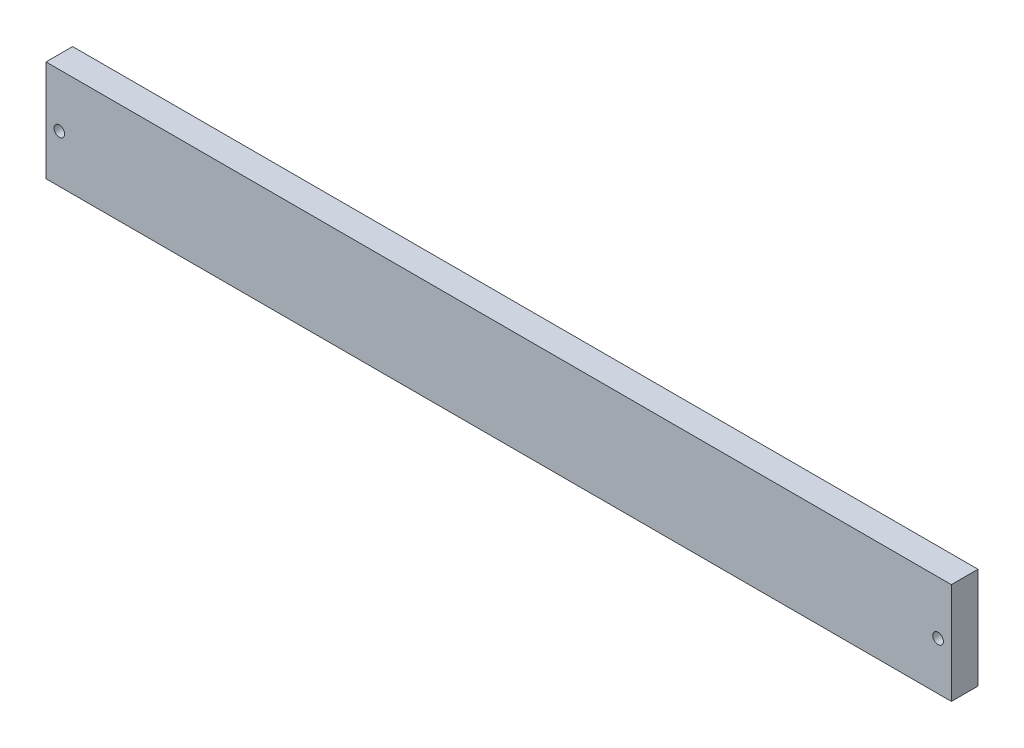
ISO-10303-21;
HEADER;
FILE_DESCRIPTION(('STEP AP214'),'2;1');
FILE_NAME('part.step','',(''),(''),'','','');
FILE_SCHEMA(('AUTOMOTIVE_DESIGN { 1 0 10303 214 1 1 1 1 }'));
ENDSEC;
DATA;
#1=APPLICATION_CONTEXT('core data for automotive mechanical design processes');
#2=APPLICATION_PROTOCOL_DEFINITION('international standard','automotive_design',2000,#1);
#3=PRODUCT_CONTEXT('',#1,'mechanical');
#4=PRODUCT('Part','Part','',(#3));
#5=PRODUCT_RELATED_PRODUCT_CATEGORY('part','',(#4));
#6=PRODUCT_DEFINITION_FORMATION('','',#4);
#7=PRODUCT_DEFINITION_CONTEXT('part definition',#1,'design');
#8=PRODUCT_DEFINITION('design','',#6,#7);
#9=PRODUCT_DEFINITION_SHAPE('','',#8);
#10=(LENGTH_UNIT() NAMED_UNIT(*) SI_UNIT(.MILLI.,.METRE.));
#11=(NAMED_UNIT(*) PLANE_ANGLE_UNIT() SI_UNIT($,.RADIAN.));
#12=(NAMED_UNIT(*) SI_UNIT($,.STERADIAN.) SOLID_ANGLE_UNIT());
#13=UNCERTAINTY_MEASURE_WITH_UNIT(LENGTH_MEASURE(1.E-05),#10,'distance_accuracy_value','');
#14=(GEOMETRIC_REPRESENTATION_CONTEXT(3) GLOBAL_UNCERTAINTY_ASSIGNED_CONTEXT((#13)) GLOBAL_UNIT_ASSIGNED_CONTEXT((#10,
#11,#12)) REPRESENTATION_CONTEXT('',''));
#15=CARTESIAN_POINT('',(0.,0.,0.));
#16=DIRECTION('',(0.,0.,1.));
#17=DIRECTION('',(1.,0.,0.));
#18=AXIS2_PLACEMENT_3D('',#15,#16,#17);
#19=CARTESIAN_POINT('',(0.,0.,10.));
#20=DIRECTION('',(1.,0.,0.));
#21=DIRECTION('',(0.,0.,-1.));
#22=AXIS2_PLACEMENT_3D('',#19,#20,#21);
#23=PLANE('',#22);
#24=DIRECTION('',(0.,-1.,0.));
#25=VECTOR('',#24,1.);
#26=CARTESIAN_POINT('',(0.,0.,0.));
#27=LINE('',#26,#25);
#28=CARTESIAN_POINT('',(0.,38.,0.));
#29=VERTEX_POINT('',#28);
#30=CARTESIAN_POINT('',(0.,0.,0.));
#31=VERTEX_POINT('',#30);
#32=EDGE_CURVE('E96',#29,#31,#27,.T.);
#33=ORIENTED_EDGE('',*,*,#32,.T.);
#34=DIRECTION('',(0.,0.,-1.));
#35=VECTOR('',#34,1.);
#36=CARTESIAN_POINT('',(0.,0.,10.));
#37=LINE('',#36,#35);
#38=CARTESIAN_POINT('',(0.,0.,10.));
#39=VERTEX_POINT('',#38);
#40=EDGE_CURVE('E11',#39,#31,#37,.T.);
#41=ORIENTED_EDGE('',*,*,#40,.F.);
#42=DIRECTION('',(0.,-1.,0.));
#43=VECTOR('',#42,1.);
#44=CARTESIAN_POINT('',(0.,0.,10.));
#45=LINE('',#44,#43);
#46=CARTESIAN_POINT('',(0.,38.,10.));
#47=VERTEX_POINT('',#46);
#48=EDGE_CURVE('E84',#47,#39,#45,.T.);
#49=ORIENTED_EDGE('',*,*,#48,.F.);
#50=DIRECTION('',(0.,0.,-1.));
#51=VECTOR('',#50,1.);
#52=CARTESIAN_POINT('',(0.,38.,10.));
#53=LINE('',#52,#51);
#54=EDGE_CURVE('E92',#47,#29,#53,.T.);
#55=ORIENTED_EDGE('',*,*,#54,.T.);
#56=EDGE_LOOP('',(#33,#41,#49,#55));
#57=FACE_BOUND('',#56,.T.);
#58=ADVANCED_FACE('F33',(#57),#23,.F.);
#59=CARTESIAN_POINT('',(0.,0.,10.));
#60=DIRECTION('',(0.,1.,0.));
#61=DIRECTION('',(0.,0.,1.));
#62=AXIS2_PLACEMENT_3D('',#59,#60,#61);
#63=PLANE('',#62);
#64=DIRECTION('',(1.,0.,0.));
#65=VECTOR('',#64,1.);
#66=CARTESIAN_POINT('',(0.,0.,0.));
#67=LINE('',#66,#65);
#68=CARTESIAN_POINT('',(340.,0.,0.));
#69=VERTEX_POINT('',#68);
#70=EDGE_CURVE('E88',#31,#69,#67,.T.);
#71=ORIENTED_EDGE('',*,*,#70,.T.);
#72=DIRECTION('',(0.,0.,-1.));
#73=VECTOR('',#72,1.);
#74=CARTESIAN_POINT('',(340.,0.,10.));
#75=LINE('',#74,#73);
#76=CARTESIAN_POINT('',(340.,0.,10.));
#77=VERTEX_POINT('',#76);
#78=EDGE_CURVE('E41',#77,#69,#75,.T.);
#79=ORIENTED_EDGE('',*,*,#78,.F.);
#80=DIRECTION('',(1.,0.,0.));
#81=VECTOR('',#80,1.);
#82=CARTESIAN_POINT('',(0.,0.,10.));
#83=LINE('',#82,#81);
#84=EDGE_CURVE('E79',#39,#77,#83,.T.);
#85=ORIENTED_EDGE('',*,*,#84,.F.);
#86=ORIENTED_EDGE('',*,*,#40,.T.);
#87=EDGE_LOOP('',(#71,#79,#85,#86));
#88=FACE_BOUND('',#87,.T.);
#89=ADVANCED_FACE('F87',(#88),#63,.F.);
#90=CARTESIAN_POINT('',(340.,0.,10.));
#91=DIRECTION('',(-1.,0.,0.));
#92=DIRECTION('',(0.,0.,1.));
#93=AXIS2_PLACEMENT_3D('',#90,#91,#92);
#94=PLANE('',#93);
#95=DIRECTION('',(0.,1.,0.));
#96=VECTOR('',#95,1.);
#97=CARTESIAN_POINT('',(340.,0.,0.));
#98=LINE('',#97,#96);
#99=CARTESIAN_POINT('',(340.,38.,0.));
#100=VERTEX_POINT('',#99);
#101=EDGE_CURVE('E66',#69,#100,#98,.T.);
#102=ORIENTED_EDGE('',*,*,#101,.T.);
#103=DIRECTION('',(0.,0.,-1.));
#104=VECTOR('',#103,1.);
#105=CARTESIAN_POINT('',(340.,38.,10.));
#106=LINE('',#105,#104);
#107=CARTESIAN_POINT('',(340.,38.,10.));
#108=VERTEX_POINT('',#107);
#109=EDGE_CURVE('E89',#108,#100,#106,.T.);
#110=ORIENTED_EDGE('',*,*,#109,.F.);
#111=DIRECTION('',(0.,1.,0.));
#112=VECTOR('',#111,1.);
#113=CARTESIAN_POINT('',(340.,0.,10.));
#114=LINE('',#113,#112);
#115=EDGE_CURVE('E82',#77,#108,#114,.T.);
#116=ORIENTED_EDGE('',*,*,#115,.F.);
#117=ORIENTED_EDGE('',*,*,#78,.T.);
#118=EDGE_LOOP('',(#102,#110,#116,#117));
#119=FACE_BOUND('',#118,.T.);
#120=ADVANCED_FACE('F90',(#119),#94,.F.);
#121=CARTESIAN_POINT('',(0.,38.,10.));
#122=DIRECTION('',(0.,-1.,0.));
#123=DIRECTION('',(0.,0.,-1.));
#124=AXIS2_PLACEMENT_3D('',#121,#122,#123);
#125=PLANE('',#124);
#126=DIRECTION('',(-1.,0.,0.));
#127=VECTOR('',#126,1.);
#128=CARTESIAN_POINT('',(0.,38.,0.));
#129=LINE('',#128,#127);
#130=EDGE_CURVE('E72',#100,#29,#129,.T.);
#131=ORIENTED_EDGE('',*,*,#130,.T.);
#132=ORIENTED_EDGE('',*,*,#54,.F.);
#133=DIRECTION('',(-1.,0.,0.));
#134=VECTOR('',#133,1.);
#135=CARTESIAN_POINT('',(0.,38.,10.));
#136=LINE('',#135,#134);
#137=EDGE_CURVE('E49',#108,#47,#136,.T.);
#138=ORIENTED_EDGE('',*,*,#137,.F.);
#139=ORIENTED_EDGE('',*,*,#109,.T.);
#140=EDGE_LOOP('',(#131,#132,#138,#139));
#141=FACE_BOUND('',#140,.T.);
#142=ADVANCED_FACE('F104',(#141),#125,.F.);
#143=CARTESIAN_POINT('',(0.,0.,10.));
#144=DIRECTION('',(0.,0.,-1.));
#145=DIRECTION('',(-1.,0.,0.));
#146=AXIS2_PLACEMENT_3D('',#143,#144,#145);
#147=PLANE('',#146);
#148=CARTESIAN_POINT('',(5.,18.,10.));
#149=DIRECTION('',(0.,0.,-1.));
#150=DIRECTION('',(-1.,0.,0.));
#151=AXIS2_PLACEMENT_3D('',#148,#149,#150);
#152=CIRCLE('',#151,2.);
#153=CARTESIAN_POINT('',(3.,18.,10.));
#154=VERTEX_POINT('',#153);
#155=EDGE_CURVE('E99',#154,#154,#152,.T.);
#156=ORIENTED_EDGE('',*,*,#155,.T.);
#157=EDGE_LOOP('',(#156));
#158=FACE_BOUND('',#157,.T.);
#159=CARTESIAN_POINT('',(335.,18.,10.));
#160=DIRECTION('',(0.,0.,-1.));
#161=DIRECTION('',(-1.,0.,0.));
#162=AXIS2_PLACEMENT_3D('',#159,#160,#161);
#163=CIRCLE('',#162,2.);
#164=CARTESIAN_POINT('',(333.,18.,10.));
#165=VERTEX_POINT('',#164);
#166=EDGE_CURVE('E112',#165,#165,#163,.T.);
#167=ORIENTED_EDGE('',*,*,#166,.T.);
#168=EDGE_LOOP('',(#167));
#169=FACE_BOUND('',#168,.T.);
#170=ORIENTED_EDGE('',*,*,#48,.T.);
#171=ORIENTED_EDGE('',*,*,#84,.T.);
#172=ORIENTED_EDGE('',*,*,#115,.T.);
#173=ORIENTED_EDGE('',*,*,#137,.T.);
#174=EDGE_LOOP('',(#170,#171,#172,#173));
#175=FACE_BOUND('',#174,.T.);
#176=ADVANCED_FACE('F80',(#158,#169,#175),#147,.F.);
#177=CARTESIAN_POINT('',(0.,0.,0.));
#178=DIRECTION('',(0.,0.,-1.));
#179=DIRECTION('',(-1.,0.,0.));
#180=AXIS2_PLACEMENT_3D('',#177,#178,#179);
#181=PLANE('',#180);
#182=CARTESIAN_POINT('',(5.,18.,0.));
#183=DIRECTION('',(0.,0.,1.));
#184=DIRECTION('',(1.,0.,0.));
#185=AXIS2_PLACEMENT_3D('',#182,#183,#184);
#186=CIRCLE('',#185,2.);
#187=CARTESIAN_POINT('',(7.00000000000001,18.,0.));
#188=VERTEX_POINT('',#187);
#189=EDGE_CURVE('E115',#188,#188,#186,.T.);
#190=ORIENTED_EDGE('',*,*,#189,.T.);
#191=EDGE_LOOP('',(#190));
#192=FACE_BOUND('',#191,.T.);
#193=CARTESIAN_POINT('',(335.,18.,0.));
#194=DIRECTION('',(0.,0.,1.));
#195=DIRECTION('',(-1.,0.,0.));
#196=AXIS2_PLACEMENT_3D('',#193,#194,#195);
#197=CIRCLE('',#196,2.);
#198=CARTESIAN_POINT('',(333.,18.,0.));
#199=VERTEX_POINT('',#198);
#200=EDGE_CURVE('E116',#199,#199,#197,.T.);
#201=ORIENTED_EDGE('',*,*,#200,.T.);
#202=EDGE_LOOP('',(#201));
#203=FACE_BOUND('',#202,.T.);
#204=ORIENTED_EDGE('',*,*,#32,.F.);
#205=ORIENTED_EDGE('',*,*,#130,.F.);
#206=ORIENTED_EDGE('',*,*,#101,.F.);
#207=ORIENTED_EDGE('',*,*,#70,.F.);
#208=EDGE_LOOP('',(#204,#205,#206,#207));
#209=FACE_BOUND('',#208,.T.);
#210=ADVANCED_FACE('F107',(#192,#203,#209),#181,.T.);
#211=CARTESIAN_POINT('',(335.,18.,0.));
#212=DIRECTION('',(0.,0.,1.));
#213=DIRECTION('',(1.,0.,0.));
#214=AXIS2_PLACEMENT_3D('',#211,#212,#213);
#215=CYLINDRICAL_SURFACE('',#214,2.);
#216=ORIENTED_EDGE('',*,*,#200,.F.);
#217=EDGE_LOOP('',(#216));
#218=FACE_BOUND('',#217,.T.);
#219=ORIENTED_EDGE('',*,*,#166,.F.);
#220=EDGE_LOOP('',(#219));
#221=FACE_BOUND('',#220,.T.);
#222=ADVANCED_FACE('F127',(#218,#221),#215,.F.);
#223=CARTESIAN_POINT('',(5.,18.,0.));
#224=DIRECTION('',(0.,0.,1.));
#225=DIRECTION('',(1.,0.,0.));
#226=AXIS2_PLACEMENT_3D('',#223,#224,#225);
#227=CYLINDRICAL_SURFACE('',#226,2.);
#228=ORIENTED_EDGE('',*,*,#189,.F.);
#229=EDGE_LOOP('',(#228));
#230=FACE_BOUND('',#229,.T.);
#231=ORIENTED_EDGE('',*,*,#155,.F.);
#232=EDGE_LOOP('',(#231));
#233=FACE_BOUND('',#232,.T.);
#234=ADVANCED_FACE('F124',(#230,#233),#227,.F.);
#235=CLOSED_SHELL('',(#58,#89,#120,#142,#176,#210,#222,#234));
#236=MANIFOLD_SOLID_BREP('B2',#235);
#237=ADVANCED_BREP_SHAPE_REPRESENTATION('',(#18,#236),#14);
#238=SHAPE_DEFINITION_REPRESENTATION(#9,#237);
ENDSEC;
END-ISO-10303-21;
